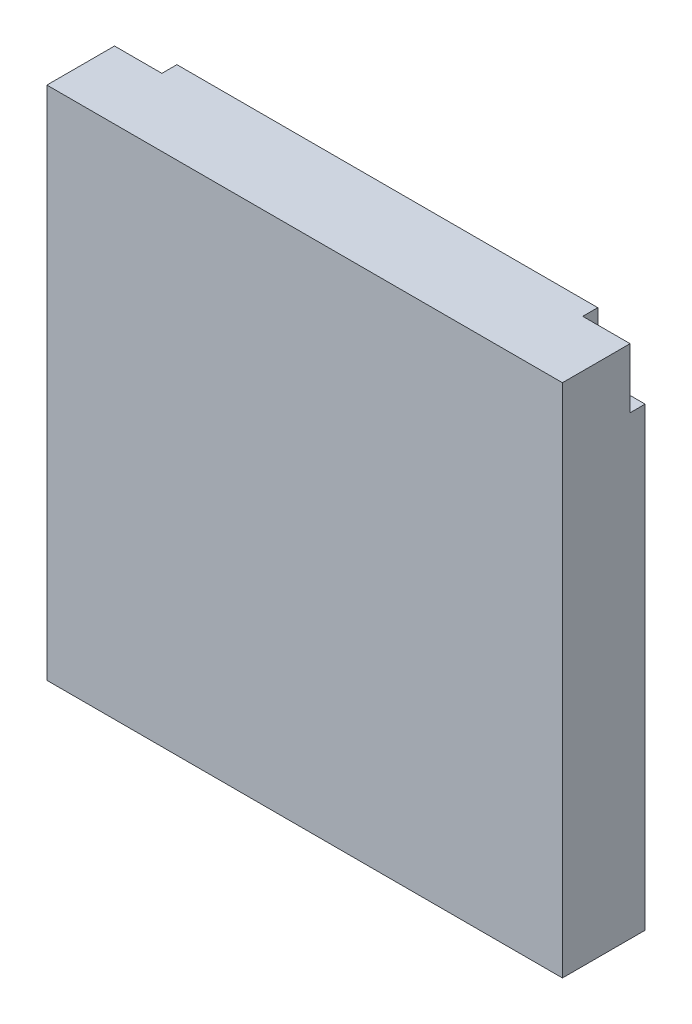
ISO-10303-21;
HEADER;
FILE_DESCRIPTION(('STEP AP214'),'2;1');
FILE_NAME('part.step','',(''),(''),'','','');
FILE_SCHEMA(('AUTOMOTIVE_DESIGN { 1 0 10303 214 1 1 1 1 }'));
ENDSEC;
DATA;
#1=APPLICATION_CONTEXT('core data for automotive mechanical design processes');
#2=APPLICATION_PROTOCOL_DEFINITION('international standard','automotive_design',2000,#1);
#3=PRODUCT_CONTEXT('',#1,'mechanical');
#4=PRODUCT('Part','Part','',(#3));
#5=PRODUCT_RELATED_PRODUCT_CATEGORY('part','',(#4));
#6=PRODUCT_DEFINITION_FORMATION('','',#4);
#7=PRODUCT_DEFINITION_CONTEXT('part definition',#1,'design');
#8=PRODUCT_DEFINITION('design','',#6,#7);
#9=PRODUCT_DEFINITION_SHAPE('','',#8);
#10=(LENGTH_UNIT() NAMED_UNIT(*) SI_UNIT(.MILLI.,.METRE.));
#11=(NAMED_UNIT(*) PLANE_ANGLE_UNIT() SI_UNIT($,.RADIAN.));
#12=(NAMED_UNIT(*) SI_UNIT($,.STERADIAN.) SOLID_ANGLE_UNIT());
#13=UNCERTAINTY_MEASURE_WITH_UNIT(LENGTH_MEASURE(1.E-05),#10,'distance_accuracy_value','');
#14=(GEOMETRIC_REPRESENTATION_CONTEXT(3) GLOBAL_UNCERTAINTY_ASSIGNED_CONTEXT((#13)) GLOBAL_UNIT_ASSIGNED_CONTEXT((#10,
#11,#12)) REPRESENTATION_CONTEXT('',''));
#15=CARTESIAN_POINT('',(0.,0.,0.));
#16=DIRECTION('',(0.,0.,1.));
#17=DIRECTION('',(1.,0.,0.));
#18=AXIS2_PLACEMENT_3D('',#15,#16,#17);
#19=CARTESIAN_POINT('',(0.,0.,0.55));
#20=DIRECTION('',(1.,0.,0.));
#21=DIRECTION('',(0.,0.,-1.));
#22=AXIS2_PLACEMENT_3D('',#19,#20,#21);
#23=PLANE('',#22);
#24=DIRECTION('',(0.,1.,0.));
#25=VECTOR('',#24,1.);
#26=CARTESIAN_POINT('',(0.,3.43,0.1));
#27=LINE('',#26,#25);
#28=CARTESIAN_POINT('',(0.,3.03178642442958,0.1));
#29=VERTEX_POINT('',#28);
#30=CARTESIAN_POINT('',(0.,3.43,0.1));
#31=VERTEX_POINT('',#30);
#32=EDGE_CURVE('E114',#29,#31,#27,.T.);
#33=ORIENTED_EDGE('',*,*,#32,.F.);
#34=DIRECTION('',(0.,0.,-1.));
#35=VECTOR('',#34,1.);
#36=CARTESIAN_POINT('',(0.,3.03178642442958,0.1));
#37=LINE('',#36,#35);
#38=CARTESIAN_POINT('',(0.,3.03178642442958,0.));
#39=VERTEX_POINT('',#38);
#40=EDGE_CURVE('E192',#29,#39,#37,.T.);
#41=ORIENTED_EDGE('',*,*,#40,.T.);
#42=DIRECTION('',(0.,-1.,0.));
#43=VECTOR('',#42,1.);
#44=CARTESIAN_POINT('',(0.,0.,0.));
#45=LINE('',#44,#43);
#46=CARTESIAN_POINT('',(0.,0.,0.));
#47=VERTEX_POINT('',#46);
#48=EDGE_CURVE('E167',#39,#47,#45,.T.);
#49=ORIENTED_EDGE('',*,*,#48,.T.);
#50=DIRECTION('',(0.,0.,-1.));
#51=VECTOR('',#50,1.);
#52=CARTESIAN_POINT('',(0.,0.,0.55));
#53=LINE('',#52,#51);
#54=CARTESIAN_POINT('',(0.,0.,0.55));
#55=VERTEX_POINT('',#54);
#56=EDGE_CURVE('E11',#55,#47,#53,.T.);
#57=ORIENTED_EDGE('',*,*,#56,.F.);
#58=DIRECTION('',(0.,-1.,0.));
#59=VECTOR('',#58,1.);
#60=CARTESIAN_POINT('',(0.,0.,0.55));
#61=LINE('',#60,#59);
#62=CARTESIAN_POINT('',(0.,3.43,0.55));
#63=VERTEX_POINT('',#62);
#64=EDGE_CURVE('E137',#63,#55,#61,.T.);
#65=ORIENTED_EDGE('',*,*,#64,.F.);
#66=DIRECTION('',(0.,0.,-1.));
#67=VECTOR('',#66,1.);
#68=CARTESIAN_POINT('',(0.,3.43,0.55));
#69=LINE('',#68,#67);
#70=EDGE_CURVE('E131',#63,#31,#69,.T.);
#71=ORIENTED_EDGE('',*,*,#70,.T.);
#72=EDGE_LOOP('',(#33,#41,#49,#57,#65,#71));
#73=FACE_BOUND('',#72,.T.);
#74=ADVANCED_FACE('F35',(#73),#23,.F.);
#75=CARTESIAN_POINT('',(0.,0.,0.55));
#76=DIRECTION('',(0.,1.,0.));
#77=DIRECTION('',(0.,0.,1.));
#78=AXIS2_PLACEMENT_3D('',#75,#76,#77);
#79=PLANE('',#78);
#80=DIRECTION('',(1.,0.,0.));
#81=VECTOR('',#80,1.);
#82=CARTESIAN_POINT('',(0.,0.,0.));
#83=LINE('',#82,#81);
#84=CARTESIAN_POINT('',(3.43,0.,0.));
#85=VERTEX_POINT('',#84);
#86=EDGE_CURVE('E164',#47,#85,#83,.T.);
#87=ORIENTED_EDGE('',*,*,#86,.T.);
#88=DIRECTION('',(0.,0.,-1.));
#89=VECTOR('',#88,1.);
#90=CARTESIAN_POINT('',(3.43,0.,0.55));
#91=LINE('',#90,#89);
#92=CARTESIAN_POINT('',(3.43,0.,0.55));
#93=VERTEX_POINT('',#92);
#94=EDGE_CURVE('E42',#93,#85,#91,.T.);
#95=ORIENTED_EDGE('',*,*,#94,.F.);
#96=DIRECTION('',(1.,0.,0.));
#97=VECTOR('',#96,1.);
#98=CARTESIAN_POINT('',(0.,0.,0.55));
#99=LINE('',#98,#97);
#100=EDGE_CURVE('E173',#55,#93,#99,.T.);
#101=ORIENTED_EDGE('',*,*,#100,.F.);
#102=ORIENTED_EDGE('',*,*,#56,.T.);
#103=EDGE_LOOP('',(#87,#95,#101,#102));
#104=FACE_BOUND('',#103,.T.);
#105=ADVANCED_FACE('F232',(#104),#79,.F.);
#106=CARTESIAN_POINT('',(3.43,0.,0.55));
#107=DIRECTION('',(-1.,0.,0.));
#108=DIRECTION('',(0.,0.,1.));
#109=AXIS2_PLACEMENT_3D('',#106,#107,#108);
#110=PLANE('',#109);
#111=DIRECTION('',(0.,1.,0.));
#112=VECTOR('',#111,1.);
#113=CARTESIAN_POINT('',(3.43,0.,0.));
#114=LINE('',#113,#112);
#115=CARTESIAN_POINT('',(3.43,3.03178642442958,0.));
#116=VERTEX_POINT('',#115);
#117=EDGE_CURVE('E155',#85,#116,#114,.T.);
#118=ORIENTED_EDGE('',*,*,#117,.T.);
#119=DIRECTION('',(0.,0.,-1.));
#120=VECTOR('',#119,1.);
#121=CARTESIAN_POINT('',(3.43,3.03178642442958,0.1));
#122=LINE('',#121,#120);
#123=CARTESIAN_POINT('',(3.43,3.03178642442958,0.1));
#124=VERTEX_POINT('',#123);
#125=EDGE_CURVE('E57',#124,#116,#122,.T.);
#126=ORIENTED_EDGE('',*,*,#125,.F.);
#127=DIRECTION('',(0.,-1.,0.));
#128=VECTOR('',#127,1.);
#129=CARTESIAN_POINT('',(3.43,3.43,0.1));
#130=LINE('',#129,#128);
#131=CARTESIAN_POINT('',(3.43,3.43,0.1));
#132=VERTEX_POINT('',#131);
#133=EDGE_CURVE('E190',#132,#124,#130,.T.);
#134=ORIENTED_EDGE('',*,*,#133,.F.);
#135=DIRECTION('',(0.,0.,-1.));
#136=VECTOR('',#135,1.);
#137=CARTESIAN_POINT('',(3.43,3.43,0.55));
#138=LINE('',#137,#136);
#139=CARTESIAN_POINT('',(3.43,3.43,0.55));
#140=VERTEX_POINT('',#139);
#141=EDGE_CURVE('E138',#140,#132,#138,.T.);
#142=ORIENTED_EDGE('',*,*,#141,.F.);
#143=DIRECTION('',(0.,1.,0.));
#144=VECTOR('',#143,1.);
#145=CARTESIAN_POINT('',(3.43,0.,0.55));
#146=LINE('',#145,#144);
#147=EDGE_CURVE('E143',#93,#140,#146,.T.);
#148=ORIENTED_EDGE('',*,*,#147,.F.);
#149=ORIENTED_EDGE('',*,*,#94,.T.);
#150=EDGE_LOOP('',(#118,#126,#134,#142,#148,#149));
#151=FACE_BOUND('',#150,.T.);
#152=ADVANCED_FACE('F154',(#151),#110,.F.);
#153=CARTESIAN_POINT('',(0.,3.43,0.55));
#154=DIRECTION('',(0.,-1.,0.));
#155=DIRECTION('',(1.,0.,0.));
#156=AXIS2_PLACEMENT_3D('',#153,#154,#155);
#157=PLANE('',#156);
#158=DIRECTION('',(-1.,0.,0.));
#159=VECTOR('',#158,1.);
#160=CARTESIAN_POINT('',(0.,3.43,0.));
#161=LINE('',#160,#159);
#162=CARTESIAN_POINT('',(3.115,3.43,0.));
#163=VERTEX_POINT('',#162);
#164=CARTESIAN_POINT('',(0.315000000000003,3.43,0.));
#165=VERTEX_POINT('',#164);
#166=EDGE_CURVE('E146',#163,#165,#161,.T.);
#167=ORIENTED_EDGE('',*,*,#166,.T.);
#168=DIRECTION('',(0.,0.,-1.));
#169=VECTOR('',#168,1.);
#170=CARTESIAN_POINT('',(0.315000000000003,3.43,0.1));
#171=LINE('',#170,#169);
#172=CARTESIAN_POINT('',(0.315000000000003,3.43,0.1));
#173=VERTEX_POINT('',#172);
#174=EDGE_CURVE('E49',#173,#165,#171,.T.);
#175=ORIENTED_EDGE('',*,*,#174,.F.);
#176=DIRECTION('',(1.,0.,0.));
#177=VECTOR('',#176,1.);
#178=CARTESIAN_POINT('',(0.,3.43,0.1));
#179=LINE('',#178,#177);
#180=EDGE_CURVE('E118',#31,#173,#179,.T.);
#181=ORIENTED_EDGE('',*,*,#180,.F.);
#182=ORIENTED_EDGE('',*,*,#70,.F.);
#183=DIRECTION('',(-1.,0.,0.));
#184=VECTOR('',#183,1.);
#185=CARTESIAN_POINT('',(0.,3.43,0.55));
#186=LINE('',#185,#184);
#187=EDGE_CURVE('E139',#140,#63,#186,.T.);
#188=ORIENTED_EDGE('',*,*,#187,.F.);
#189=ORIENTED_EDGE('',*,*,#141,.T.);
#190=DIRECTION('',(1.,0.,0.));
#191=VECTOR('',#190,1.);
#192=CARTESIAN_POINT('',(3.43,3.43,0.1));
#193=LINE('',#192,#191);
#194=CARTESIAN_POINT('',(3.115,3.43,0.1));
#195=VERTEX_POINT('',#194);
#196=EDGE_CURVE('E184',#195,#132,#193,.T.);
#197=ORIENTED_EDGE('',*,*,#196,.F.);
#198=DIRECTION('',(0.,0.,-1.));
#199=VECTOR('',#198,1.);
#200=CARTESIAN_POINT('',(3.115,3.43,0.1));
#201=LINE('',#200,#199);
#202=EDGE_CURVE('E179',#195,#163,#201,.T.);
#203=ORIENTED_EDGE('',*,*,#202,.T.);
#204=EDGE_LOOP('',(#167,#175,#181,#182,#188,#189,#197,#203));
#205=FACE_BOUND('',#204,.T.);
#206=ADVANCED_FACE('F129',(#205),#157,.F.);
#207=CARTESIAN_POINT('',(0.,0.,0.55));
#208=DIRECTION('',(0.,0.,-1.));
#209=DIRECTION('',(-1.,0.,0.));
#210=AXIS2_PLACEMENT_3D('',#207,#208,#209);
#211=PLANE('',#210);
#212=ORIENTED_EDGE('',*,*,#64,.T.);
#213=ORIENTED_EDGE('',*,*,#100,.T.);
#214=ORIENTED_EDGE('',*,*,#147,.T.);
#215=ORIENTED_EDGE('',*,*,#187,.T.);
#216=EDGE_LOOP('',(#212,#213,#214,#215));
#217=FACE_BOUND('',#216,.T.);
#218=ADVANCED_FACE('F245',(#217),#211,.F.);
#219=CARTESIAN_POINT('',(0.,0.,0.));
#220=DIRECTION('',(0.,0.,-1.));
#221=DIRECTION('',(-1.,0.,0.));
#222=AXIS2_PLACEMENT_3D('',#219,#220,#221);
#223=PLANE('',#222);
#224=DIRECTION('',(-1.,0.,0.));
#225=VECTOR('',#224,1.);
#226=CARTESIAN_POINT('',(0.,3.03178642442958,0.));
#227=LINE('',#226,#225);
#228=CARTESIAN_POINT('',(0.315000000000003,3.03178642442958,0.));
#229=VERTEX_POINT('',#228);
#230=EDGE_CURVE('E124',#229,#39,#227,.T.);
#231=ORIENTED_EDGE('',*,*,#230,.F.);
#232=DIRECTION('',(0.,-1.,0.));
#233=VECTOR('',#232,1.);
#234=CARTESIAN_POINT('',(0.315000000000003,3.43,0.));
#235=LINE('',#234,#233);
#236=EDGE_CURVE('E207',#165,#229,#235,.T.);
#237=ORIENTED_EDGE('',*,*,#236,.F.);
#238=ORIENTED_EDGE('',*,*,#166,.F.);
#239=DIRECTION('',(0.,1.,0.));
#240=VECTOR('',#239,1.);
#241=CARTESIAN_POINT('',(3.115,3.43,0.));
#242=LINE('',#241,#240);
#243=CARTESIAN_POINT('',(3.115,3.03178642442958,0.));
#244=VERTEX_POINT('',#243);
#245=EDGE_CURVE('E188',#244,#163,#242,.T.);
#246=ORIENTED_EDGE('',*,*,#245,.F.);
#247=DIRECTION('',(-1.,0.,0.));
#248=VECTOR('',#247,1.);
#249=CARTESIAN_POINT('',(3.43,3.03178642442958,0.));
#250=LINE('',#249,#248);
#251=EDGE_CURVE('E166',#116,#244,#250,.T.);
#252=ORIENTED_EDGE('',*,*,#251,.F.);
#253=ORIENTED_EDGE('',*,*,#117,.F.);
#254=ORIENTED_EDGE('',*,*,#86,.F.);
#255=ORIENTED_EDGE('',*,*,#48,.F.);
#256=EDGE_LOOP('',(#231,#237,#238,#246,#252,#253,#254,#255));
#257=FACE_BOUND('',#256,.T.);
#258=CARTESIAN_POINT('',(3.115,0.328910615525053,0.));
#259=DIRECTION('',(0.,0.,-1.));
#260=DIRECTION('',(-1.,0.,0.));
#261=AXIS2_PLACEMENT_3D('',#258,#259,#260);
#262=CIRCLE('',#261,0.12797311264065);
#263=CARTESIAN_POINT('',(2.98702688735935,0.328910615525053,0.));
#264=VERTEX_POINT('',#263);
#265=EDGE_CURVE('E176',#264,#264,#262,.T.);
#266=ORIENTED_EDGE('',*,*,#265,.F.);
#267=EDGE_LOOP('',(#266));
#268=FACE_BOUND('',#267,.T.);
#269=ADVANCED_FACE('F161',(#257,#268),#223,.T.);
#270=CARTESIAN_POINT('',(3.115,0.328910615525053,0.1));
#271=DIRECTION('',(0.,0.,-1.));
#272=DIRECTION('',(-1.,0.,0.));
#273=AXIS2_PLACEMENT_3D('',#270,#271,#272);
#274=CYLINDRICAL_SURFACE('',#273,0.12797311264065);
#275=CARTESIAN_POINT('',(3.115,0.328910615525053,0.1));
#276=DIRECTION('',(0.,0.,-1.));
#277=DIRECTION('',(-1.,0.,0.));
#278=AXIS2_PLACEMENT_3D('',#275,#276,#277);
#279=CIRCLE('',#278,0.12797311264065);
#280=CARTESIAN_POINT('',(2.98702688735935,0.328910615525053,0.1));
#281=VERTEX_POINT('',#280);
#282=EDGE_CURVE('E170',#281,#281,#279,.T.);
#283=ORIENTED_EDGE('',*,*,#282,.F.);
#284=EDGE_LOOP('',(#283));
#285=FACE_BOUND('',#284,.T.);
#286=ORIENTED_EDGE('',*,*,#265,.T.);
#287=EDGE_LOOP('',(#286));
#288=FACE_BOUND('',#287,.T.);
#289=ADVANCED_FACE('F248',(#285,#288),#274,.F.);
#290=CARTESIAN_POINT('',(3.115,0.328910615525053,0.1));
#291=DIRECTION('',(0.,0.,-1.));
#292=DIRECTION('',(-1.,0.,0.));
#293=AXIS2_PLACEMENT_3D('',#290,#291,#292);
#294=PLANE('',#293);
#295=ORIENTED_EDGE('',*,*,#282,.T.);
#296=EDGE_LOOP('',(#295));
#297=FACE_BOUND('',#296,.T.);
#298=ADVANCED_FACE('F228',(#297),#294,.T.);
#299=CARTESIAN_POINT('',(3.115,3.43,0.1));
#300=DIRECTION('',(-1.,0.,0.));
#301=DIRECTION('',(0.,0.,1.));
#302=AXIS2_PLACEMENT_3D('',#299,#300,#301);
#303=PLANE('',#302);
#304=ORIENTED_EDGE('',*,*,#245,.T.);
#305=ORIENTED_EDGE('',*,*,#202,.F.);
#306=DIRECTION('',(0.,1.,0.));
#307=VECTOR('',#306,1.);
#308=CARTESIAN_POINT('',(3.115,3.43,0.1));
#309=LINE('',#308,#307);
#310=CARTESIAN_POINT('',(3.115,3.03178642442958,0.1));
#311=VERTEX_POINT('',#310);
#312=EDGE_CURVE('E194',#311,#195,#309,.T.);
#313=ORIENTED_EDGE('',*,*,#312,.F.);
#314=DIRECTION('',(0.,0.,-1.));
#315=VECTOR('',#314,1.);
#316=CARTESIAN_POINT('',(3.115,3.03178642442958,0.1));
#317=LINE('',#316,#315);
#318=EDGE_CURVE('E183',#311,#244,#317,.T.);
#319=ORIENTED_EDGE('',*,*,#318,.T.);
#320=EDGE_LOOP('',(#304,#305,#313,#319));
#321=FACE_BOUND('',#320,.T.);
#322=ADVANCED_FACE('F216',(#321),#303,.F.);
#323=CARTESIAN_POINT('',(3.43,3.03178642442958,0.1));
#324=DIRECTION('',(0.,-1.,0.));
#325=DIRECTION('',(0.,0.,-1.));
#326=AXIS2_PLACEMENT_3D('',#323,#324,#325);
#327=PLANE('',#326);
#328=ORIENTED_EDGE('',*,*,#251,.T.);
#329=ORIENTED_EDGE('',*,*,#318,.F.);
#330=DIRECTION('',(-1.,0.,0.));
#331=VECTOR('',#330,1.);
#332=CARTESIAN_POINT('',(3.43,3.03178642442958,0.1));
#333=LINE('',#332,#331);
#334=EDGE_CURVE('E197',#124,#311,#333,.T.);
#335=ORIENTED_EDGE('',*,*,#334,.F.);
#336=ORIENTED_EDGE('',*,*,#125,.T.);
#337=EDGE_LOOP('',(#328,#329,#335,#336));
#338=FACE_BOUND('',#337,.T.);
#339=ADVANCED_FACE('F220',(#338),#327,.F.);
#340=CARTESIAN_POINT('',(0.,0.,0.1));
#341=DIRECTION('',(0.,0.,-1.));
#342=DIRECTION('',(-1.,0.,0.));
#343=AXIS2_PLACEMENT_3D('',#340,#341,#342);
#344=PLANE('',#343);
#345=ORIENTED_EDGE('',*,*,#133,.T.);
#346=ORIENTED_EDGE('',*,*,#334,.T.);
#347=ORIENTED_EDGE('',*,*,#312,.T.);
#348=ORIENTED_EDGE('',*,*,#196,.T.);
#349=EDGE_LOOP('',(#345,#346,#347,#348));
#350=FACE_BOUND('',#349,.T.);
#351=ADVANCED_FACE('F218',(#350),#344,.T.);
#352=CARTESIAN_POINT('',(0.,3.03178642442958,0.1));
#353=DIRECTION('',(0.,-1.,0.));
#354=DIRECTION('',(0.,0.,-1.));
#355=AXIS2_PLACEMENT_3D('',#352,#353,#354);
#356=PLANE('',#355);
#357=ORIENTED_EDGE('',*,*,#230,.T.);
#358=ORIENTED_EDGE('',*,*,#40,.F.);
#359=DIRECTION('',(-1.,0.,0.));
#360=VECTOR('',#359,1.);
#361=CARTESIAN_POINT('',(0.,3.03178642442958,0.1));
#362=LINE('',#361,#360);
#363=CARTESIAN_POINT('',(0.315000000000003,3.03178642442958,0.1));
#364=VERTEX_POINT('',#363);
#365=EDGE_CURVE('E120',#364,#29,#362,.T.);
#366=ORIENTED_EDGE('',*,*,#365,.F.);
#367=DIRECTION('',(0.,0.,-1.));
#368=VECTOR('',#367,1.);
#369=CARTESIAN_POINT('',(0.315000000000003,3.03178642442958,0.1));
#370=LINE('',#369,#368);
#371=EDGE_CURVE('E203',#364,#229,#370,.T.);
#372=ORIENTED_EDGE('',*,*,#371,.T.);
#373=EDGE_LOOP('',(#357,#358,#366,#372));
#374=FACE_BOUND('',#373,.T.);
#375=ADVANCED_FACE('F211',(#374),#356,.F.);
#376=CARTESIAN_POINT('',(0.315000000000003,3.43,0.1));
#377=DIRECTION('',(1.,0.,0.));
#378=DIRECTION('',(0.,1.,0.));
#379=AXIS2_PLACEMENT_3D('',#376,#377,#378);
#380=PLANE('',#379);
#381=ORIENTED_EDGE('',*,*,#236,.T.);
#382=ORIENTED_EDGE('',*,*,#371,.F.);
#383=DIRECTION('',(0.,-1.,0.));
#384=VECTOR('',#383,1.);
#385=CARTESIAN_POINT('',(0.315000000000003,3.43,0.1));
#386=LINE('',#385,#384);
#387=EDGE_CURVE('E133',#173,#364,#386,.T.);
#388=ORIENTED_EDGE('',*,*,#387,.F.);
#389=ORIENTED_EDGE('',*,*,#174,.T.);
#390=EDGE_LOOP('',(#381,#382,#388,#389));
#391=FACE_BOUND('',#390,.T.);
#392=ADVANCED_FACE('F287',(#391),#380,.F.);
#393=CARTESIAN_POINT('',(0.,0.,0.1));
#394=DIRECTION('',(0.,0.,1.));
#395=DIRECTION('',(1.,0.,0.));
#396=AXIS2_PLACEMENT_3D('',#393,#394,#395);
#397=PLANE('',#396);
#398=ORIENTED_EDGE('',*,*,#32,.T.);
#399=ORIENTED_EDGE('',*,*,#180,.T.);
#400=ORIENTED_EDGE('',*,*,#387,.T.);
#401=ORIENTED_EDGE('',*,*,#365,.T.);
#402=EDGE_LOOP('',(#398,#399,#400,#401));
#403=FACE_BOUND('',#402,.T.);
#404=ADVANCED_FACE('F116',(#403),#397,.F.);
#405=CLOSED_SHELL('',(#74,#105,#152,#206,#218,#269,#289,#298,#322,#339,#351,#375,#392,#404));
#406=MANIFOLD_SOLID_BREP('B2',#405);
#407=ADVANCED_BREP_SHAPE_REPRESENTATION('',(#18,#406),#14);
#408=SHAPE_DEFINITION_REPRESENTATION(#9,#407);
ENDSEC;
END-ISO-10303-21;
